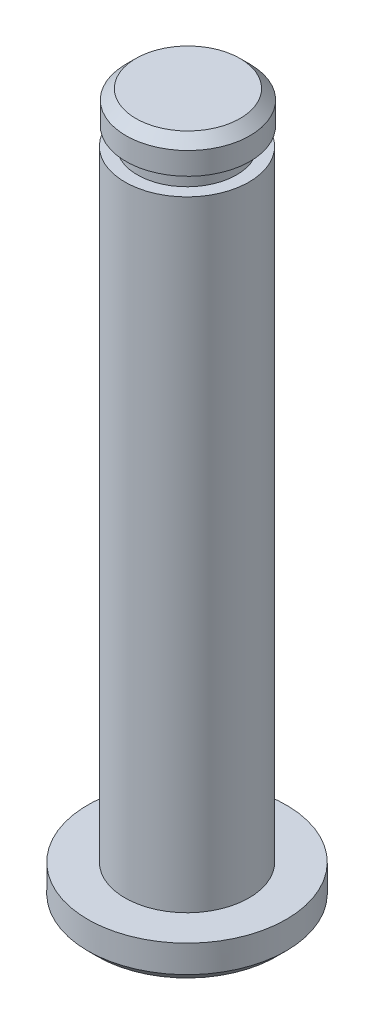
ISO-10303-21;
HEADER;
FILE_DESCRIPTION(('STEP AP214'),'2;1');
FILE_NAME('part.step','',(''),(''),'','','');
FILE_SCHEMA(('AUTOMOTIVE_DESIGN { 1 0 10303 214 1 1 1 1 }'));
ENDSEC;
DATA;
#1=APPLICATION_CONTEXT('core data for automotive mechanical design processes');
#2=APPLICATION_PROTOCOL_DEFINITION('international standard','automotive_design',2000,#1);
#3=PRODUCT_CONTEXT('',#1,'mechanical');
#4=PRODUCT('Part','Part','',(#3));
#5=PRODUCT_RELATED_PRODUCT_CATEGORY('part','',(#4));
#6=PRODUCT_DEFINITION_FORMATION('','',#4);
#7=PRODUCT_DEFINITION_CONTEXT('part definition',#1,'design');
#8=PRODUCT_DEFINITION('design','',#6,#7);
#9=PRODUCT_DEFINITION_SHAPE('','',#8);
#10=(LENGTH_UNIT() NAMED_UNIT(*) SI_UNIT(.MILLI.,.METRE.));
#11=(NAMED_UNIT(*) PLANE_ANGLE_UNIT() SI_UNIT($,.RADIAN.));
#12=(NAMED_UNIT(*) SI_UNIT($,.STERADIAN.) SOLID_ANGLE_UNIT());
#13=UNCERTAINTY_MEASURE_WITH_UNIT(LENGTH_MEASURE(1.E-05),#10,'distance_accuracy_value','');
#14=(GEOMETRIC_REPRESENTATION_CONTEXT(3) GLOBAL_UNCERTAINTY_ASSIGNED_CONTEXT((#13)) GLOBAL_UNIT_ASSIGNED_CONTEXT((#10,
#11,#12)) REPRESENTATION_CONTEXT('',''));
#15=CARTESIAN_POINT('',(0.,0.,0.));
#16=DIRECTION('',(0.,0.,1.));
#17=DIRECTION('',(1.,0.,0.));
#18=AXIS2_PLACEMENT_3D('',#15,#16,#17);
#19=CARTESIAN_POINT('',(0.,28.1,-0.038502673796736));
#20=DIRECTION('',(0.,-1.,0.));
#21=DIRECTION('',(0.,0.,-1.));
#22=AXIS2_PLACEMENT_3D('',#19,#20,#21);
#23=CONICAL_SURFACE('',#22,2.5,0.785398163397447);
#24=CARTESIAN_POINT('',(0.,28.1,-0.038502673796736));
#25=DIRECTION('',(0.,-1.,0.));
#26=DIRECTION('',(0.,0.,-1.));
#27=AXIS2_PLACEMENT_3D('',#24,#25,#26);
#28=CIRCLE('',#27,2.5);
#29=CARTESIAN_POINT('',(0.,28.1,-2.53850267379674));
#30=VERTEX_POINT('',#29);
#31=EDGE_CURVE('E73',#30,#30,#28,.T.);
#32=ORIENTED_EDGE('',*,*,#31,.F.);
#33=EDGE_LOOP('',(#32));
#34=FACE_BOUND('',#33,.T.);
#35=CARTESIAN_POINT('',(0.,28.5,-0.038502673796736));
#36=DIRECTION('',(0.,1.,0.));
#37=DIRECTION('',(0.,0.,-1.));
#38=AXIS2_PLACEMENT_3D('',#35,#36,#37);
#39=CIRCLE('',#38,2.1);
#40=CARTESIAN_POINT('',(0.,28.5,-2.13850267379674));
#41=VERTEX_POINT('',#40);
#42=EDGE_CURVE('E10',#41,#41,#39,.T.);
#43=ORIENTED_EDGE('',*,*,#42,.F.);
#44=EDGE_LOOP('',(#43));
#45=FACE_BOUND('',#44,.T.);
#46=ADVANCED_FACE('F15',(#34,#45),#23,.T.);
#47=CARTESIAN_POINT('',(0.,0.4,0.));
#48=DIRECTION('',(0.,1.,0.));
#49=DIRECTION('',(0.,0.,1.));
#50=AXIS2_PLACEMENT_3D('',#47,#48,#49);
#51=CONICAL_SURFACE('',#50,4.,0.785398163397449);
#52=CARTESIAN_POINT('',(0.,0.4,0.));
#53=DIRECTION('',(0.,1.,0.));
#54=DIRECTION('',(0.,0.,1.));
#55=AXIS2_PLACEMENT_3D('',#52,#53,#54);
#56=CIRCLE('',#55,4.);
#57=CARTESIAN_POINT('',(0.,0.4,4.));
#58=VERTEX_POINT('',#57);
#59=EDGE_CURVE('E96',#58,#58,#56,.T.);
#60=ORIENTED_EDGE('',*,*,#59,.F.);
#61=EDGE_LOOP('',(#60));
#62=FACE_BOUND('',#61,.T.);
#63=CARTESIAN_POINT('',(0.,0.,0.));
#64=DIRECTION('',(0.,-1.,0.));
#65=DIRECTION('',(0.,0.,1.));
#66=AXIS2_PLACEMENT_3D('',#63,#64,#65);
#67=CIRCLE('',#66,3.6);
#68=CARTESIAN_POINT('',(0.,0.,3.6));
#69=VERTEX_POINT('',#68);
#70=EDGE_CURVE('E88',#69,#69,#67,.T.);
#71=ORIENTED_EDGE('',*,*,#70,.F.);
#72=EDGE_LOOP('',(#71));
#73=FACE_BOUND('',#72,.T.);
#74=ADVANCED_FACE('F115',(#62,#73),#51,.T.);
#75=CARTESIAN_POINT('',(0.,27.2,-0.038502673796736));
#76=DIRECTION('',(0.,-1.,0.));
#77=DIRECTION('',(0.,0.,-1.));
#78=AXIS2_PLACEMENT_3D('',#75,#76,#77);
#79=PLANE('',#78);
#80=CARTESIAN_POINT('',(0.,27.2,-0.038502673796736));
#81=DIRECTION('',(0.,-1.,0.));
#82=DIRECTION('',(0.,0.,-1.));
#83=AXIS2_PLACEMENT_3D('',#80,#81,#82);
#84=CIRCLE('',#83,2.5);
#85=CARTESIAN_POINT('',(0.,27.2,-2.53850267379674));
#86=VERTEX_POINT('',#85);
#87=EDGE_CURVE('E25',#86,#86,#84,.T.);
#88=ORIENTED_EDGE('',*,*,#87,.T.);
#89=EDGE_LOOP('',(#88));
#90=FACE_BOUND('',#89,.T.);
#91=CARTESIAN_POINT('',(0.,27.2,0.));
#92=DIRECTION('',(0.,-1.,0.));
#93=DIRECTION('',(0.,0.,-1.));
#94=AXIS2_PLACEMENT_3D('',#91,#92,#93);
#95=CIRCLE('',#94,2.);
#96=CARTESIAN_POINT('',(0.,27.2,-2.));
#97=VERTEX_POINT('',#96);
#98=EDGE_CURVE('E18',#97,#97,#95,.T.);
#99=ORIENTED_EDGE('',*,*,#98,.F.);
#100=EDGE_LOOP('',(#99));
#101=FACE_BOUND('',#100,.T.);
#102=ADVANCED_FACE('F118',(#90,#101),#79,.T.);
#103=CARTESIAN_POINT('',(0.,28.5,-0.038502673796736));
#104=DIRECTION('',(0.,-1.,0.));
#105=DIRECTION('',(0.,0.,-1.));
#106=AXIS2_PLACEMENT_3D('',#103,#104,#105);
#107=PLANE('',#106);
#108=ORIENTED_EDGE('',*,*,#42,.T.);
#109=EDGE_LOOP('',(#108));
#110=FACE_BOUND('',#109,.T.);
#111=ADVANCED_FACE('F145',(#110),#107,.F.);
#112=CARTESIAN_POINT('',(0.,28.5,-0.038502673796736));
#113=DIRECTION('',(0.,-1.,0.));
#114=DIRECTION('',(0.,0.,-1.));
#115=AXIS2_PLACEMENT_3D('',#112,#113,#114);
#116=CYLINDRICAL_SURFACE('',#115,2.5);
#117=ORIENTED_EDGE('',*,*,#87,.F.);
#118=EDGE_LOOP('',(#117));
#119=FACE_BOUND('',#118,.T.);
#120=ORIENTED_EDGE('',*,*,#31,.T.);
#121=EDGE_LOOP('',(#120));
#122=FACE_BOUND('',#121,.T.);
#123=ADVANCED_FACE('F143',(#119,#122),#116,.T.);
#124=CARTESIAN_POINT('',(0.,27.2,0.));
#125=DIRECTION('',(0.,-1.,0.));
#126=DIRECTION('',(0.,0.,-1.));
#127=AXIS2_PLACEMENT_3D('',#124,#125,#126);
#128=CYLINDRICAL_SURFACE('',#127,2.);
#129=CARTESIAN_POINT('',(0.,26.5,0.));
#130=DIRECTION('',(0.,-1.,0.));
#131=DIRECTION('',(0.,0.,-1.));
#132=AXIS2_PLACEMENT_3D('',#129,#130,#131);
#133=CIRCLE('',#132,2.);
#134=CARTESIAN_POINT('',(0.,26.5,-2.));
#135=VERTEX_POINT('',#134);
#136=EDGE_CURVE('E74',#135,#135,#133,.T.);
#137=ORIENTED_EDGE('',*,*,#136,.F.);
#138=EDGE_LOOP('',(#137));
#139=FACE_BOUND('',#138,.T.);
#140=ORIENTED_EDGE('',*,*,#98,.T.);
#141=EDGE_LOOP('',(#140));
#142=FACE_BOUND('',#141,.T.);
#143=ADVANCED_FACE('F70',(#139,#142),#128,.T.);
#144=CARTESIAN_POINT('',(0.,26.5,0.));
#145=DIRECTION('',(0.,-1.,0.));
#146=DIRECTION('',(0.,0.,-1.));
#147=AXIS2_PLACEMENT_3D('',#144,#145,#146);
#148=PLANE('',#147);
#149=CARTESIAN_POINT('',(0.,26.5,0.));
#150=DIRECTION('',(0.,-1.,0.));
#151=DIRECTION('',(0.,0.,-1.));
#152=AXIS2_PLACEMENT_3D('',#149,#150,#151);
#153=CIRCLE('',#152,2.5);
#154=CARTESIAN_POINT('',(0.,26.5,-2.5));
#155=VERTEX_POINT('',#154);
#156=EDGE_CURVE('E81',#155,#155,#153,.T.);
#157=ORIENTED_EDGE('',*,*,#156,.F.);
#158=EDGE_LOOP('',(#157));
#159=FACE_BOUND('',#158,.T.);
#160=ORIENTED_EDGE('',*,*,#136,.T.);
#161=EDGE_LOOP('',(#160));
#162=FACE_BOUND('',#161,.T.);
#163=ADVANCED_FACE('F132',(#159,#162),#148,.F.);
#164=CARTESIAN_POINT('',(0.,26.5,0.));
#165=DIRECTION('',(0.,-1.,0.));
#166=DIRECTION('',(0.,0.,-1.));
#167=AXIS2_PLACEMENT_3D('',#164,#165,#166);
#168=CYLINDRICAL_SURFACE('',#167,2.5);
#169=CARTESIAN_POINT('',(0.,1.5,0.));
#170=DIRECTION('',(0.,-1.,0.));
#171=DIRECTION('',(0.,0.,-1.));
#172=AXIS2_PLACEMENT_3D('',#169,#170,#171);
#173=CIRCLE('',#172,2.5);
#174=CARTESIAN_POINT('',(0.,1.5,-2.5));
#175=VERTEX_POINT('',#174);
#176=EDGE_CURVE('E90',#175,#175,#173,.T.);
#177=ORIENTED_EDGE('',*,*,#176,.F.);
#178=EDGE_LOOP('',(#177));
#179=FACE_BOUND('',#178,.T.);
#180=ORIENTED_EDGE('',*,*,#156,.T.);
#181=EDGE_LOOP('',(#180));
#182=FACE_BOUND('',#181,.T.);
#183=ADVANCED_FACE('F124',(#179,#182),#168,.T.);
#184=CARTESIAN_POINT('',(0.,0.,0.));
#185=DIRECTION('',(0.,1.,0.));
#186=DIRECTION('',(1.,0.,0.));
#187=AXIS2_PLACEMENT_3D('',#184,#185,#186);
#188=PLANE('',#187);
#189=ORIENTED_EDGE('',*,*,#70,.T.);
#190=EDGE_LOOP('',(#189));
#191=FACE_BOUND('',#190,.T.);
#192=ADVANCED_FACE('F122',(#191),#188,.F.);
#193=CARTESIAN_POINT('',(0.,1.5,0.));
#194=DIRECTION('',(0.,1.,0.));
#195=DIRECTION('',(1.,0.,0.));
#196=AXIS2_PLACEMENT_3D('',#193,#194,#195);
#197=PLANE('',#196);
#198=CARTESIAN_POINT('',(0.,1.5,0.));
#199=DIRECTION('',(0.,1.,0.));
#200=DIRECTION('',(1.,0.,0.));
#201=AXIS2_PLACEMENT_3D('',#198,#199,#200);
#202=CIRCLE('',#201,4.);
#203=CARTESIAN_POINT('',(4.,1.5,0.));
#204=VERTEX_POINT('',#203);
#205=EDGE_CURVE('E93',#204,#204,#202,.T.);
#206=ORIENTED_EDGE('',*,*,#205,.T.);
#207=EDGE_LOOP('',(#206));
#208=FACE_BOUND('',#207,.T.);
#209=ORIENTED_EDGE('',*,*,#176,.T.);
#210=EDGE_LOOP('',(#209));
#211=FACE_BOUND('',#210,.T.);
#212=ADVANCED_FACE('F106',(#208,#211),#197,.T.);
#213=CARTESIAN_POINT('',(0.,1.5,0.));
#214=DIRECTION('',(0.,-1.,0.));
#215=DIRECTION('',(0.,0.,-1.));
#216=AXIS2_PLACEMENT_3D('',#213,#214,#215);
#217=CYLINDRICAL_SURFACE('',#216,4.);
#218=ORIENTED_EDGE('',*,*,#205,.F.);
#219=EDGE_LOOP('',(#218));
#220=FACE_BOUND('',#219,.T.);
#221=ORIENTED_EDGE('',*,*,#59,.T.);
#222=EDGE_LOOP('',(#221));
#223=FACE_BOUND('',#222,.T.);
#224=ADVANCED_FACE('F109',(#220,#223),#217,.T.);
#225=CLOSED_SHELL('',(#46,#74,#102,#111,#123,#143,#163,#183,#192,#212,#224));
#226=MANIFOLD_SOLID_BREP('B1',#225);
#227=ADVANCED_BREP_SHAPE_REPRESENTATION('',(#18,#226),#14);
#228=SHAPE_DEFINITION_REPRESENTATION(#9,#227);
ENDSEC;
END-ISO-10303-21;
